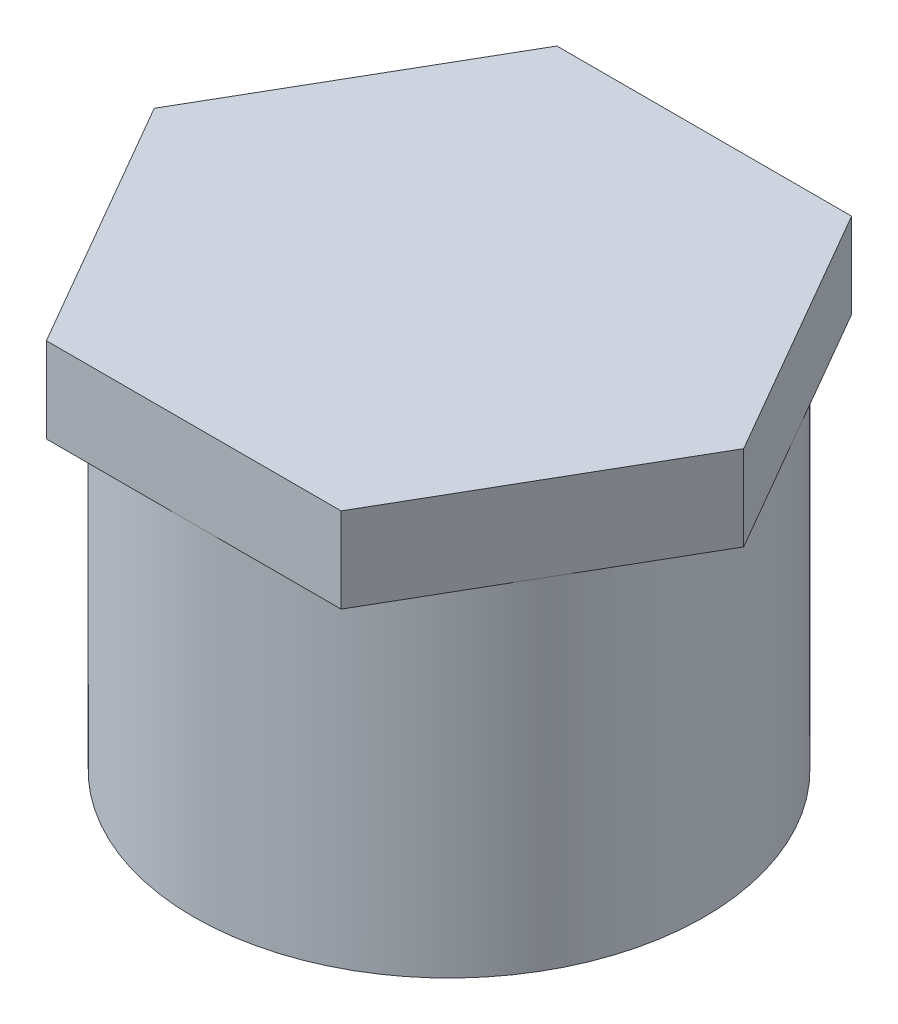
ISO-10303-21;
HEADER;
FILE_DESCRIPTION(('STEP AP214'),'2;1');
FILE_NAME('part.step','',(''),(''),'','','');
FILE_SCHEMA(('AUTOMOTIVE_DESIGN { 1 0 10303 214 1 1 1 1 }'));
ENDSEC;
DATA;
#1=APPLICATION_CONTEXT('core data for automotive mechanical design processes');
#2=APPLICATION_PROTOCOL_DEFINITION('international standard','automotive_design',2000,#1);
#3=PRODUCT_CONTEXT('',#1,'mechanical');
#4=PRODUCT('Part','Part','',(#3));
#5=PRODUCT_RELATED_PRODUCT_CATEGORY('part','',(#4));
#6=PRODUCT_DEFINITION_FORMATION('','',#4);
#7=PRODUCT_DEFINITION_CONTEXT('part definition',#1,'design');
#8=PRODUCT_DEFINITION('design','',#6,#7);
#9=PRODUCT_DEFINITION_SHAPE('','',#8);
#10=(LENGTH_UNIT() NAMED_UNIT(*) SI_UNIT(.MILLI.,.METRE.));
#11=(NAMED_UNIT(*) PLANE_ANGLE_UNIT() SI_UNIT($,.RADIAN.));
#12=(NAMED_UNIT(*) SI_UNIT($,.STERADIAN.) SOLID_ANGLE_UNIT());
#13=UNCERTAINTY_MEASURE_WITH_UNIT(LENGTH_MEASURE(1.E-05),#10,'distance_accuracy_value','');
#14=(GEOMETRIC_REPRESENTATION_CONTEXT(3) GLOBAL_UNCERTAINTY_ASSIGNED_CONTEXT((#13)) GLOBAL_UNIT_ASSIGNED_CONTEXT((#10,
#11,#12)) REPRESENTATION_CONTEXT('',''));
#15=CARTESIAN_POINT('',(0.,0.,0.));
#16=DIRECTION('',(0.,0.,1.));
#17=DIRECTION('',(1.,0.,0.));
#18=AXIS2_PLACEMENT_3D('',#15,#16,#17);
#19=CARTESIAN_POINT('',(0.,5.08,0.));
#20=DIRECTION('',(0.,-1.,0.));
#21=DIRECTION('',(0.,0.,-1.));
#22=AXIS2_PLACEMENT_3D('',#19,#20,#21);
#23=CYLINDRICAL_SURFACE('',#22,3.81);
#24=CARTESIAN_POINT('',(0.,5.08,0.));
#25=DIRECTION('',(0.,1.,0.));
#26=DIRECTION('',(0.,0.,1.));
#27=AXIS2_PLACEMENT_3D('',#24,#25,#26);
#28=CIRCLE('',#27,3.81);
#29=CARTESIAN_POINT('',(0.,5.08,3.81));
#30=VERTEX_POINT('',#29);
#31=CARTESIAN_POINT('',(3.29955678841871,5.08,1.90500000000001));
#32=VERTEX_POINT('',#31);
#33=EDGE_CURVE('E11',#30,#32,#28,.T.);
#34=ORIENTED_EDGE('',*,*,#33,.F.);
#35=CARTESIAN_POINT('',(-3.29955678841871,5.08,1.905));
#36=VERTEX_POINT('',#35);
#37=EDGE_CURVE('E53',#36,#30,#28,.T.);
#38=ORIENTED_EDGE('',*,*,#37,.F.);
#39=CARTESIAN_POINT('',(-3.29955678841871,5.08,-1.905));
#40=VERTEX_POINT('',#39);
#41=EDGE_CURVE('E63',#40,#36,#28,.T.);
#42=ORIENTED_EDGE('',*,*,#41,.F.);
#43=CARTESIAN_POINT('',(0.,5.08,-3.81));
#44=VERTEX_POINT('',#43);
#45=EDGE_CURVE('E222',#44,#40,#28,.T.);
#46=ORIENTED_EDGE('',*,*,#45,.F.);
#47=CARTESIAN_POINT('',(3.29955678841871,5.08,-1.905));
#48=VERTEX_POINT('',#47);
#49=EDGE_CURVE('E225',#48,#44,#28,.T.);
#50=ORIENTED_EDGE('',*,*,#49,.F.);
#51=EDGE_CURVE('E52',#32,#48,#28,.T.);
#52=ORIENTED_EDGE('',*,*,#51,.F.);
#53=EDGE_LOOP('',(#34,#38,#42,#46,#50,#52));
#54=FACE_BOUND('',#53,.T.);
#55=CARTESIAN_POINT('',(0.,0.,0.));
#56=DIRECTION('',(0.,1.,0.));
#57=DIRECTION('',(0.,0.,1.));
#58=AXIS2_PLACEMENT_3D('',#55,#56,#57);
#59=CIRCLE('',#58,3.81);
#60=CARTESIAN_POINT('',(0.,0.,3.81));
#61=VERTEX_POINT('',#60);
#62=EDGE_CURVE('E46',#61,#61,#59,.T.);
#63=ORIENTED_EDGE('',*,*,#62,.T.);
#64=EDGE_LOOP('',(#63));
#65=FACE_BOUND('',#64,.T.);
#66=ADVANCED_FACE('F43',(#54,#65),#23,.T.);
#67=CARTESIAN_POINT('',(0.,0.,0.));
#68=DIRECTION('',(0.,1.,0.));
#69=DIRECTION('',(0.,0.,1.));
#70=AXIS2_PLACEMENT_3D('',#67,#68,#69);
#71=PLANE('',#70);
#72=ORIENTED_EDGE('',*,*,#62,.F.);
#73=EDGE_LOOP('',(#72));
#74=FACE_BOUND('',#73,.T.);
#75=ADVANCED_FACE('F251',(#74),#71,.F.);
#76=CARTESIAN_POINT('',(0.,5.08,0.));
#77=DIRECTION('',(0.,-1.,0.));
#78=DIRECTION('',(0.,0.,-1.));
#79=AXIS2_PLACEMENT_3D('',#76,#77,#78);
#80=PLANE('',#79);
#81=DIRECTION('',(1.,0.,0.));
#82=VECTOR('',#81,1.);
#83=CARTESIAN_POINT('',(2.19970452561247,5.08,3.81));
#84=LINE('',#83,#82);
#85=CARTESIAN_POINT('',(2.19970452561247,5.08,3.81));
#86=VERTEX_POINT('',#85);
#87=EDGE_CURVE('E182',#30,#86,#84,.T.);
#88=ORIENTED_EDGE('',*,*,#87,.F.);
#89=ORIENTED_EDGE('',*,*,#33,.T.);
#90=DIRECTION('',(0.500000000000002,0.,-0.866025403784438));
#91=VECTOR('',#90,1.);
#92=CARTESIAN_POINT('',(4.39940905122495,5.08,0.));
#93=LINE('',#92,#91);
#94=EDGE_CURVE('E173',#86,#32,#93,.T.);
#95=ORIENTED_EDGE('',*,*,#94,.F.);
#96=EDGE_LOOP('',(#88,#89,#95));
#97=FACE_BOUND('',#96,.T.);
#98=ADVANCED_FACE('F240',(#97),#80,.T.);
#99=CARTESIAN_POINT('',(4.39940905122495,5.08,0.));
#100=VERTEX_POINT('',#99);
#101=EDGE_CURVE('E177',#32,#100,#93,.T.);
#102=ORIENTED_EDGE('',*,*,#101,.F.);
#103=ORIENTED_EDGE('',*,*,#51,.T.);
#104=DIRECTION('',(-0.500000000000001,0.,-0.866025403784438));
#105=VECTOR('',#104,1.);
#106=CARTESIAN_POINT('',(2.19970452561247,5.08,-3.81));
#107=LINE('',#106,#105);
#108=EDGE_CURVE('E168',#100,#48,#107,.T.);
#109=ORIENTED_EDGE('',*,*,#108,.F.);
#110=EDGE_LOOP('',(#102,#103,#109));
#111=FACE_BOUND('',#110,.T.);
#112=ADVANCED_FACE('F243',(#111),#80,.T.);
#113=CARTESIAN_POINT('',(2.19970452561247,5.08,-3.81));
#114=VERTEX_POINT('',#113);
#115=EDGE_CURVE('E172',#48,#114,#107,.T.);
#116=ORIENTED_EDGE('',*,*,#115,.F.);
#117=ORIENTED_EDGE('',*,*,#49,.T.);
#118=DIRECTION('',(-1.,0.,0.));
#119=VECTOR('',#118,1.);
#120=CARTESIAN_POINT('',(-2.19970452561248,5.08,-3.81));
#121=LINE('',#120,#119);
#122=EDGE_CURVE('E135',#114,#44,#121,.T.);
#123=ORIENTED_EDGE('',*,*,#122,.F.);
#124=EDGE_LOOP('',(#116,#117,#123));
#125=FACE_BOUND('',#124,.T.);
#126=ADVANCED_FACE('F246',(#125),#80,.T.);
#127=CARTESIAN_POINT('',(-2.19970452561248,5.08,-3.81));
#128=VERTEX_POINT('',#127);
#129=EDGE_CURVE('E167',#44,#128,#121,.T.);
#130=ORIENTED_EDGE('',*,*,#129,.F.);
#131=ORIENTED_EDGE('',*,*,#45,.T.);
#132=DIRECTION('',(-0.499999999999999,0.,0.866025403784439));
#133=VECTOR('',#132,1.);
#134=CARTESIAN_POINT('',(-4.39940905122495,5.08,0.));
#135=LINE('',#134,#133);
#136=EDGE_CURVE('E187',#128,#40,#135,.T.);
#137=ORIENTED_EDGE('',*,*,#136,.F.);
#138=EDGE_LOOP('',(#130,#131,#137));
#139=FACE_BOUND('',#138,.T.);
#140=ADVANCED_FACE('F221',(#139),#80,.T.);
#141=CARTESIAN_POINT('',(-4.39940905122495,5.08,0.));
#142=VERTEX_POINT('',#141);
#143=EDGE_CURVE('E140',#40,#142,#135,.T.);
#144=ORIENTED_EDGE('',*,*,#143,.F.);
#145=ORIENTED_EDGE('',*,*,#41,.T.);
#146=DIRECTION('',(0.499999999999999,0.,0.866025403784439));
#147=VECTOR('',#146,1.);
#148=CARTESIAN_POINT('',(-2.19970452561248,5.08,3.81));
#149=LINE('',#148,#147);
#150=EDGE_CURVE('E183',#142,#36,#149,.T.);
#151=ORIENTED_EDGE('',*,*,#150,.F.);
#152=EDGE_LOOP('',(#144,#145,#151));
#153=FACE_BOUND('',#152,.T.);
#154=ADVANCED_FACE('F227',(#153),#80,.T.);
#155=CARTESIAN_POINT('',(-4.39940905122495,6.35,0.));
#156=DIRECTION('',(0.866025403784439,0.,0.499999999999999));
#157=DIRECTION('',(0.499999999999999,0.,-0.866025403784439));
#158=AXIS2_PLACEMENT_3D('',#155,#156,#157);
#159=PLANE('',#158);
#160=ORIENTED_EDGE('',*,*,#136,.T.);
#161=ORIENTED_EDGE('',*,*,#143,.T.);
#162=DIRECTION('',(0.,-1.,0.));
#163=VECTOR('',#162,1.);
#164=CARTESIAN_POINT('',(-4.39940905122495,6.35,0.));
#165=LINE('',#164,#163);
#166=CARTESIAN_POINT('',(-4.39940905122495,6.35,0.));
#167=VERTEX_POINT('',#166);
#168=EDGE_CURVE('E118',#167,#142,#165,.T.);
#169=ORIENTED_EDGE('',*,*,#168,.F.);
#170=DIRECTION('',(-0.499999999999999,0.,0.866025403784439));
#171=VECTOR('',#170,1.);
#172=CARTESIAN_POINT('',(-4.39940905122495,6.35,0.));
#173=LINE('',#172,#171);
#174=CARTESIAN_POINT('',(-2.19970452561248,6.35,-3.81));
#175=VERTEX_POINT('',#174);
#176=EDGE_CURVE('E125',#175,#167,#173,.T.);
#177=ORIENTED_EDGE('',*,*,#176,.F.);
#178=DIRECTION('',(0.,-1.,0.));
#179=VECTOR('',#178,1.);
#180=CARTESIAN_POINT('',(-2.19970452561248,6.35,-3.81));
#181=LINE('',#180,#179);
#182=EDGE_CURVE('E161',#175,#128,#181,.T.);
#183=ORIENTED_EDGE('',*,*,#182,.T.);
#184=EDGE_LOOP('',(#160,#161,#169,#177,#183));
#185=FACE_BOUND('',#184,.T.);
#186=ADVANCED_FACE('F138',(#185),#159,.F.);
#187=CARTESIAN_POINT('',(-2.19970452561248,6.35,3.81));
#188=DIRECTION('',(0.866025403784439,0.,-0.499999999999999));
#189=DIRECTION('',(-0.499999999999999,0.,-0.866025403784439));
#190=AXIS2_PLACEMENT_3D('',#187,#188,#189);
#191=PLANE('',#190);
#192=ORIENTED_EDGE('',*,*,#150,.T.);
#193=CARTESIAN_POINT('',(-2.19970452561248,5.08,3.81));
#194=VERTEX_POINT('',#193);
#195=EDGE_CURVE('E186',#36,#194,#149,.T.);
#196=ORIENTED_EDGE('',*,*,#195,.T.);
#197=DIRECTION('',(0.,-1.,0.));
#198=VECTOR('',#197,1.);
#199=CARTESIAN_POINT('',(-2.19970452561248,6.35,3.81));
#200=LINE('',#199,#198);
#201=CARTESIAN_POINT('',(-2.19970452561248,6.35,3.81));
#202=VERTEX_POINT('',#201);
#203=EDGE_CURVE('E120',#202,#194,#200,.T.);
#204=ORIENTED_EDGE('',*,*,#203,.F.);
#205=DIRECTION('',(0.499999999999999,0.,0.866025403784439));
#206=VECTOR('',#205,1.);
#207=CARTESIAN_POINT('',(-2.19970452561248,6.35,3.81));
#208=LINE('',#207,#206);
#209=EDGE_CURVE('E113',#167,#202,#208,.T.);
#210=ORIENTED_EDGE('',*,*,#209,.F.);
#211=ORIENTED_EDGE('',*,*,#168,.T.);
#212=EDGE_LOOP('',(#192,#196,#204,#210,#211));
#213=FACE_BOUND('',#212,.T.);
#214=ADVANCED_FACE('F116',(#213),#191,.F.);
#215=CARTESIAN_POINT('',(2.19970452561247,6.35,3.81));
#216=DIRECTION('',(0.,0.,-1.));
#217=DIRECTION('',(-1.,0.,0.));
#218=AXIS2_PLACEMENT_3D('',#215,#216,#217);
#219=PLANE('',#218);
#220=EDGE_CURVE('E178',#194,#30,#84,.T.);
#221=ORIENTED_EDGE('',*,*,#220,.T.);
#222=ORIENTED_EDGE('',*,*,#87,.T.);
#223=DIRECTION('',(0.,-1.,0.));
#224=VECTOR('',#223,1.);
#225=CARTESIAN_POINT('',(2.19970452561247,6.35,3.81));
#226=LINE('',#225,#224);
#227=CARTESIAN_POINT('',(2.19970452561247,6.35,3.81));
#228=VERTEX_POINT('',#227);
#229=EDGE_CURVE('E147',#228,#86,#226,.T.);
#230=ORIENTED_EDGE('',*,*,#229,.F.);
#231=DIRECTION('',(1.,0.,0.));
#232=VECTOR('',#231,1.);
#233=CARTESIAN_POINT('',(2.19970452561247,6.35,3.81));
#234=LINE('',#233,#232);
#235=EDGE_CURVE('E124',#202,#228,#234,.T.);
#236=ORIENTED_EDGE('',*,*,#235,.F.);
#237=ORIENTED_EDGE('',*,*,#203,.T.);
#238=EDGE_LOOP('',(#221,#222,#230,#236,#237));
#239=FACE_BOUND('',#238,.T.);
#240=ADVANCED_FACE('F203',(#239),#219,.F.);
#241=CARTESIAN_POINT('',(4.39940905122495,6.35,0.));
#242=DIRECTION('',(-0.866025403784438,0.,-0.500000000000002));
#243=DIRECTION('',(-0.500000000000002,0.,0.866025403784438));
#244=AXIS2_PLACEMENT_3D('',#241,#242,#243);
#245=PLANE('',#244);
#246=ORIENTED_EDGE('',*,*,#94,.T.);
#247=ORIENTED_EDGE('',*,*,#101,.T.);
#248=DIRECTION('',(0.,-1.,0.));
#249=VECTOR('',#248,1.);
#250=CARTESIAN_POINT('',(4.39940905122495,6.35,0.));
#251=LINE('',#250,#249);
#252=CARTESIAN_POINT('',(4.39940905122495,6.35,0.));
#253=VERTEX_POINT('',#252);
#254=EDGE_CURVE('E153',#253,#100,#251,.T.);
#255=ORIENTED_EDGE('',*,*,#254,.F.);
#256=DIRECTION('',(0.500000000000002,0.,-0.866025403784438));
#257=VECTOR('',#256,1.);
#258=CARTESIAN_POINT('',(4.39940905122495,6.35,0.));
#259=LINE('',#258,#257);
#260=EDGE_CURVE('E195',#228,#253,#259,.T.);
#261=ORIENTED_EDGE('',*,*,#260,.F.);
#262=ORIENTED_EDGE('',*,*,#229,.T.);
#263=EDGE_LOOP('',(#246,#247,#255,#261,#262));
#264=FACE_BOUND('',#263,.T.);
#265=ADVANCED_FACE('F207',(#264),#245,.F.);
#266=CARTESIAN_POINT('',(2.19970452561247,6.35,-3.81));
#267=DIRECTION('',(-0.866025403784438,0.,0.500000000000001));
#268=DIRECTION('',(0.500000000000001,0.,0.866025403784438));
#269=AXIS2_PLACEMENT_3D('',#266,#267,#268);
#270=PLANE('',#269);
#271=ORIENTED_EDGE('',*,*,#108,.T.);
#272=ORIENTED_EDGE('',*,*,#115,.T.);
#273=DIRECTION('',(0.,-1.,0.));
#274=VECTOR('',#273,1.);
#275=CARTESIAN_POINT('',(2.19970452561247,6.35,-3.81));
#276=LINE('',#275,#274);
#277=CARTESIAN_POINT('',(2.19970452561247,6.35,-3.81));
#278=VERTEX_POINT('',#277);
#279=EDGE_CURVE('E157',#278,#114,#276,.T.);
#280=ORIENTED_EDGE('',*,*,#279,.F.);
#281=DIRECTION('',(-0.500000000000001,0.,-0.866025403784438));
#282=VECTOR('',#281,1.);
#283=CARTESIAN_POINT('',(2.19970452561247,6.35,-3.81));
#284=LINE('',#283,#282);
#285=EDGE_CURVE('E192',#253,#278,#284,.T.);
#286=ORIENTED_EDGE('',*,*,#285,.F.);
#287=ORIENTED_EDGE('',*,*,#254,.T.);
#288=EDGE_LOOP('',(#271,#272,#280,#286,#287));
#289=FACE_BOUND('',#288,.T.);
#290=ADVANCED_FACE('F213',(#289),#270,.F.);
#291=CARTESIAN_POINT('',(-2.19970452561248,6.35,-3.81));
#292=DIRECTION('',(0.,0.,1.));
#293=DIRECTION('',(1.,0.,0.));
#294=AXIS2_PLACEMENT_3D('',#291,#292,#293);
#295=PLANE('',#294);
#296=ORIENTED_EDGE('',*,*,#122,.T.);
#297=ORIENTED_EDGE('',*,*,#129,.T.);
#298=ORIENTED_EDGE('',*,*,#182,.F.);
#299=DIRECTION('',(-1.,0.,0.));
#300=VECTOR('',#299,1.);
#301=CARTESIAN_POINT('',(-2.19970452561248,6.35,-3.81));
#302=LINE('',#301,#300);
#303=EDGE_CURVE('E130',#278,#175,#302,.T.);
#304=ORIENTED_EDGE('',*,*,#303,.F.);
#305=ORIENTED_EDGE('',*,*,#279,.T.);
#306=EDGE_LOOP('',(#296,#297,#298,#304,#305));
#307=FACE_BOUND('',#306,.T.);
#308=ADVANCED_FACE('F217',(#307),#295,.F.);
#309=CARTESIAN_POINT('',(0.,6.35,0.));
#310=DIRECTION('',(0.,-1.,0.));
#311=DIRECTION('',(0.,0.,-1.));
#312=AXIS2_PLACEMENT_3D('',#309,#310,#311);
#313=PLANE('',#312);
#314=ORIENTED_EDGE('',*,*,#176,.T.);
#315=ORIENTED_EDGE('',*,*,#209,.T.);
#316=ORIENTED_EDGE('',*,*,#235,.T.);
#317=ORIENTED_EDGE('',*,*,#260,.T.);
#318=ORIENTED_EDGE('',*,*,#285,.T.);
#319=ORIENTED_EDGE('',*,*,#303,.T.);
#320=EDGE_LOOP('',(#314,#315,#316,#317,#318,#319));
#321=FACE_BOUND('',#320,.T.);
#322=ADVANCED_FACE('F128',(#321),#313,.F.);
#323=ORIENTED_EDGE('',*,*,#195,.F.);
#324=ORIENTED_EDGE('',*,*,#37,.T.);
#325=ORIENTED_EDGE('',*,*,#220,.F.);
#326=EDGE_LOOP('',(#323,#324,#325));
#327=FACE_BOUND('',#326,.T.);
#328=ADVANCED_FACE('F237',(#327),#80,.T.);
#329=CLOSED_SHELL('',(#66,#75,#98,#112,#126,#140,#154,#186,#214,#240,#265,#290,#308,#322,#328));
#330=MANIFOLD_SOLID_BREP('B2',#329);
#331=ADVANCED_BREP_SHAPE_REPRESENTATION('',(#18,#330),#14);
#332=SHAPE_DEFINITION_REPRESENTATION(#9,#331);
ENDSEC;
END-ISO-10303-21;
